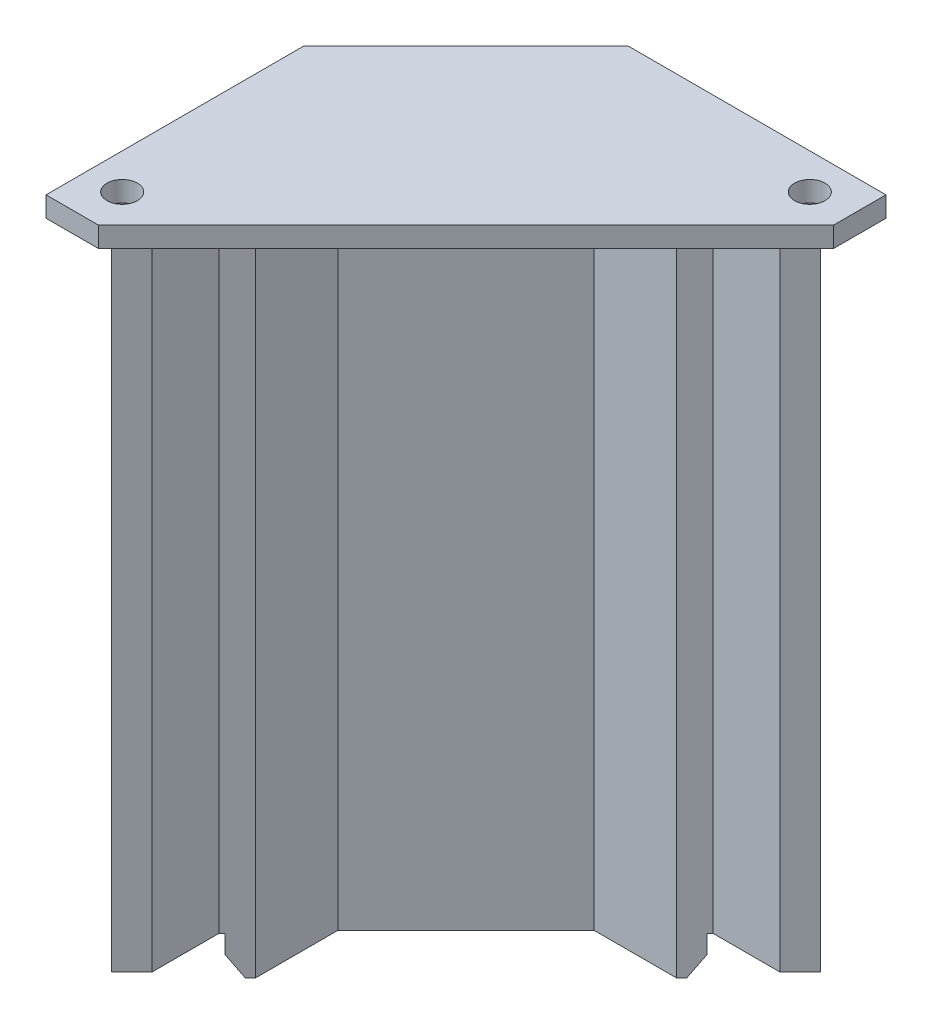
ISO-10303-21;
HEADER;
FILE_DESCRIPTION(('STEP AP214'),'2;1');
FILE_NAME('part.step','',(''),(''),'','','');
FILE_SCHEMA(('AUTOMOTIVE_DESIGN { 1 0 10303 214 1 1 1 1 }'));
ENDSEC;
DATA;
#1=APPLICATION_CONTEXT('core data for automotive mechanical design processes');
#2=APPLICATION_PROTOCOL_DEFINITION('international standard','automotive_design',2000,#1);
#3=PRODUCT_CONTEXT('',#1,'mechanical');
#4=PRODUCT('Part','Part','',(#3));
#5=PRODUCT_RELATED_PRODUCT_CATEGORY('part','',(#4));
#6=PRODUCT_DEFINITION_FORMATION('','',#4);
#7=PRODUCT_DEFINITION_CONTEXT('part definition',#1,'design');
#8=PRODUCT_DEFINITION('design','',#6,#7);
#9=PRODUCT_DEFINITION_SHAPE('','',#8);
#10=(LENGTH_UNIT() NAMED_UNIT(*) SI_UNIT(.MILLI.,.METRE.));
#11=(NAMED_UNIT(*) PLANE_ANGLE_UNIT() SI_UNIT($,.RADIAN.));
#12=(NAMED_UNIT(*) SI_UNIT($,.STERADIAN.) SOLID_ANGLE_UNIT());
#13=UNCERTAINTY_MEASURE_WITH_UNIT(LENGTH_MEASURE(1.E-05),#10,'distance_accuracy_value','');
#14=(GEOMETRIC_REPRESENTATION_CONTEXT(3) GLOBAL_UNCERTAINTY_ASSIGNED_CONTEXT((#13)) GLOBAL_UNIT_ASSIGNED_CONTEXT((#10,
#11,#12)) REPRESENTATION_CONTEXT('',''));
#15=CARTESIAN_POINT('',(0.,0.,0.));
#16=DIRECTION('',(0.,0.,1.));
#17=DIRECTION('',(1.,0.,0.));
#18=AXIS2_PLACEMENT_3D('',#15,#16,#17);
#19=CARTESIAN_POINT('',(182.9,1.6,34.0421356237306));
#20=DIRECTION('',(-1.,0.,0.));
#21=DIRECTION('',(0.,0.,1.));
#22=AXIS2_PLACEMENT_3D('',#19,#20,#21);
#23=PLANE('',#22);
#24=DIRECTION('',(0.,0.577350269189591,0.816496580927751));
#25=VECTOR('',#24,1.);
#26=CARTESIAN_POINT('',(182.9,1.1113737822094,33.3511137995986));
#27=LINE('',#26,#25);
#28=CARTESIAN_POINT('',(182.9,1.6,34.0421356237306));
#29=VERTEX_POINT('',#28);
#30=CARTESIAN_POINT('',(182.9,3.6,36.8705627484756));
#31=VERTEX_POINT('',#30);
#32=EDGE_CURVE('E302',#29,#31,#27,.T.);
#33=ORIENTED_EDGE('',*,*,#32,.F.);
#34=DIRECTION('',(0.,0.,1.));
#35=VECTOR('',#34,1.);
#36=CARTESIAN_POINT('',(182.9,1.6,55.2553390593275));
#37=LINE('',#36,#35);
#38=CARTESIAN_POINT('',(182.9,1.6,54.8310749906156));
#39=VERTEX_POINT('',#38);
#40=EDGE_CURVE('E11',#29,#39,#37,.T.);
#41=ORIENTED_EDGE('',*,*,#40,.T.);
#42=DIRECTION('',(0.,0.,1.));
#43=VECTOR('',#42,1.);
#44=CARTESIAN_POINT('',(182.9,1.6,55.2553390593275));
#45=LINE('',#44,#43);
#46=CARTESIAN_POINT('',(182.9,1.6,62.2553390593273));
#47=VERTEX_POINT('',#46);
#48=EDGE_CURVE('E321',#39,#47,#45,.T.);
#49=ORIENTED_EDGE('',*,*,#48,.T.);
#50=DIRECTION('',(0.,1.,0.));
#51=VECTOR('',#50,1.);
#52=CARTESIAN_POINT('',(182.9,1.6,62.2553390593273));
#53=LINE('',#52,#51);
#54=CARTESIAN_POINT('',(182.9,3.6,62.2553390593273));
#55=VERTEX_POINT('',#54);
#56=EDGE_CURVE('E295',#47,#55,#53,.T.);
#57=ORIENTED_EDGE('',*,*,#56,.T.);
#58=DIRECTION('',(0.,0.,1.));
#59=VECTOR('',#58,1.);
#60=CARTESIAN_POINT('',(182.9,3.6,55.2553390593275));
#61=LINE('',#60,#59);
#62=EDGE_CURVE('E385',#31,#55,#61,.T.);
#63=ORIENTED_EDGE('',*,*,#62,.F.);
#64=EDGE_LOOP('',(#33,#41,#49,#57,#63));
#65=FACE_BOUND('',#64,.T.);
#66=ADVANCED_FACE('F17',(#65),#23,.T.);
#67=CARTESIAN_POINT('',(182.65,1.35,38.0776695296636));
#68=DIRECTION('',(-0.707106781186541,0.707106781186554,0.));
#69=DIRECTION('',(0.,0.,1.));
#70=AXIS2_PLACEMENT_3D('',#67,#68,#69);
#71=PLANE('',#70);
#72=DIRECTION('',(0.577350269189631,0.577350269189619,-0.577350269189628));
#73=VECTOR('',#72,1.);
#74=CARTESIAN_POINT('',(174.004856898707,-7.2951431012931,63.7262180919086));
#75=LINE('',#74,#73);
#76=CARTESIAN_POINT('',(182.4,1.1,55.3310749906154));
#77=VERTEX_POINT('',#76);
#78=EDGE_CURVE('E283',#77,#39,#75,.T.);
#79=ORIENTED_EDGE('',*,*,#78,.T.);
#80=ORIENTED_EDGE('',*,*,#40,.F.);
#81=DIRECTION('',(-0.577350269189631,-0.577350269189619,0.577350269189628));
#82=VECTOR('',#81,1.);
#83=CARTESIAN_POINT('',(184.334433619633,3.03443361963305,32.6077020040979));
#84=LINE('',#83,#82);
#85=CARTESIAN_POINT('',(182.4,1.1,34.5421356237309));
#86=VERTEX_POINT('',#85);
#87=EDGE_CURVE('E274',#29,#86,#84,.T.);
#88=ORIENTED_EDGE('',*,*,#87,.T.);
#89=DIRECTION('',(0.,0.,1.));
#90=VECTOR('',#89,1.);
#91=CARTESIAN_POINT('',(182.4,1.1,38.0776695296636));
#92=LINE('',#91,#90);
#93=EDGE_CURVE('E28',#86,#77,#92,.T.);
#94=ORIENTED_EDGE('',*,*,#93,.T.);
#95=EDGE_LOOP('',(#79,#80,#88,#94));
#96=FACE_BOUND('',#95,.T.);
#97=ADVANCED_FACE('F612',(#96),#71,.T.);
#98=CARTESIAN_POINT('',(182.4,-66.6,34.5421356237309));
#99=DIRECTION('',(-1.,0.,0.));
#100=DIRECTION('',(0.,0.,1.));
#101=AXIS2_PLACEMENT_3D('',#98,#99,#100);
#102=PLANE('',#101);
#103=ORIENTED_EDGE('',*,*,#93,.F.);
#104=DIRECTION('',(0.,1.,0.));
#105=VECTOR('',#104,1.);
#106=CARTESIAN_POINT('',(182.4,-66.6,34.5421356237309));
#107=LINE('',#106,#105);
#108=CARTESIAN_POINT('',(182.4,-66.4,34.5421356237309));
#109=VERTEX_POINT('',#108);
#110=EDGE_CURVE('E278',#109,#86,#107,.T.);
#111=ORIENTED_EDGE('',*,*,#110,.F.);
#112=DIRECTION('',(0.,0.,1.));
#113=VECTOR('',#112,1.);
#114=CARTESIAN_POINT('',(182.4,-66.4,38.0776695296636));
#115=LINE('',#114,#113);
#116=CARTESIAN_POINT('',(182.4,-66.4,55.3310749906154));
#117=VERTEX_POINT('',#116);
#118=EDGE_CURVE('E343',#109,#117,#115,.T.);
#119=ORIENTED_EDGE('',*,*,#118,.T.);
#120=DIRECTION('',(0.,1.,0.));
#121=VECTOR('',#120,1.);
#122=CARTESIAN_POINT('',(182.4,-66.6,55.3310749906154));
#123=LINE('',#122,#121);
#124=EDGE_CURVE('E279',#117,#77,#123,.T.);
#125=ORIENTED_EDGE('',*,*,#124,.T.);
#126=EDGE_LOOP('',(#103,#111,#119,#125));
#127=FACE_BOUND('',#126,.T.);
#128=ADVANCED_FACE('F617',(#127),#102,.T.);
#129=CARTESIAN_POINT('',(185.2,-69.2,36.6307025382526));
#130=DIRECTION('',(-0.894427190999906,-0.447213595499977,0.));
#131=DIRECTION('',(-0.447213595499977,0.894427190999906,0.));
#132=AXIS2_PLACEMENT_3D('',#129,#130,#131);
#133=PLANE('',#132);
#134=DIRECTION('',(0.,0.,1.));
#135=VECTOR('',#134,1.);
#136=CARTESIAN_POINT('',(185.7,-70.2,36.6307025382526));
#137=LINE('',#136,#135);
#138=CARTESIAN_POINT('',(185.7,-70.2,35.9090403795621));
#139=VERTEX_POINT('',#138);
#140=CARTESIAN_POINT('',(185.7,-70.2,45.4357431100375));
#141=VERTEX_POINT('',#140);
#142=EDGE_CURVE('E389',#139,#141,#137,.T.);
#143=ORIENTED_EDGE('',*,*,#142,.T.);
#144=DIRECTION('',(-0.408248290463854,0.816496580927663,0.408248290463998));
#145=VECTOR('',#144,1.);
#146=CARTESIAN_POINT('',(185.408753380982,-69.6175067619646,45.7269897290554));
#147=LINE('',#146,#145);
#148=CARTESIAN_POINT('',(184.7,-68.2,46.435743110038));
#149=VERTEX_POINT('',#148);
#150=EDGE_CURVE('E348',#141,#149,#147,.T.);
#151=ORIENTED_EDGE('',*,*,#150,.T.);
#152=DIRECTION('',(0.,0.,-1.));
#153=VECTOR('',#152,1.);
#154=CARTESIAN_POINT('',(184.7,-68.2,36.6307025382526));
#155=LINE('',#154,#153);
#156=CARTESIAN_POINT('',(184.7,-68.2,35.494826817189));
#157=VERTEX_POINT('',#156);
#158=EDGE_CURVE('E42',#149,#157,#155,.T.);
#159=ORIENTED_EDGE('',*,*,#158,.T.);
#160=DIRECTION('',(-0.439732612032324,0.879465224064601,-0.18214321172152));
#161=VECTOR('',#160,1.);
#162=CARTESIAN_POINT('',(185.7,-70.2,35.9090403795621));
#163=LINE('',#162,#161);
#164=EDGE_CURVE('E328',#139,#157,#163,.T.);
#165=ORIENTED_EDGE('',*,*,#164,.F.);
#166=EDGE_LOOP('',(#143,#151,#159,#165));
#167=FACE_BOUND('',#166,.T.);
#168=ADVANCED_FACE('F19',(#167),#133,.T.);
#169=CARTESIAN_POINT('',(184.7,-70.6,35.494826817189));
#170=DIRECTION('',(-1.,0.,0.));
#171=DIRECTION('',(0.,0.,1.));
#172=AXIS2_PLACEMENT_3D('',#169,#170,#171);
#173=PLANE('',#172);
#174=ORIENTED_EDGE('',*,*,#158,.F.);
#175=DIRECTION('',(0.,-1.,0.));
#176=VECTOR('',#175,1.);
#177=CARTESIAN_POINT('',(184.7,-66.6,46.435743110038));
#178=LINE('',#177,#176);
#179=CARTESIAN_POINT('',(184.7,-66.4,46.435743110038));
#180=VERTEX_POINT('',#179);
#181=EDGE_CURVE('E345',#180,#149,#178,.T.);
#182=ORIENTED_EDGE('',*,*,#181,.F.);
#183=DIRECTION('',(0.,0.,-1.));
#184=VECTOR('',#183,1.);
#185=CARTESIAN_POINT('',(184.7,-66.4,38.5540151263927));
#186=LINE('',#185,#184);
#187=CARTESIAN_POINT('',(184.7,-66.4,35.494826817189));
#188=VERTEX_POINT('',#187);
#189=EDGE_CURVE('E363',#180,#188,#186,.T.);
#190=ORIENTED_EDGE('',*,*,#189,.T.);
#191=DIRECTION('',(0.,1.,0.));
#192=VECTOR('',#191,1.);
#193=CARTESIAN_POINT('',(184.7,-70.6,35.494826817189));
#194=LINE('',#193,#192);
#195=EDGE_CURVE('E369',#157,#188,#194,.T.);
#196=ORIENTED_EDGE('',*,*,#195,.F.);
#197=EDGE_LOOP('',(#174,#182,#190,#196));
#198=FACE_BOUND('',#197,.T.);
#199=ADVANCED_FACE('F1158',(#198),#173,.T.);
#200=CARTESIAN_POINT('',(184.4,-66.6,46.7357431100381));
#201=DIRECTION('',(0.707106781186671,0.,0.707106781186424));
#202=DIRECTION('',(0.,-1.,0.));
#203=AXIS2_PLACEMENT_3D('',#200,#201,#202);
#204=PLANE('',#203);
#205=ORIENTED_EDGE('',*,*,#150,.F.);
#206=DIRECTION('',(0.707106781186424,0.,-0.707106781186671));
#207=VECTOR('',#206,1.);
#208=CARTESIAN_POINT('',(187.649550410227,-70.2,43.48619269981));
#209=LINE('',#208,#207);
#210=CARTESIAN_POINT('',(186.2,-70.2,44.935743110038));
#211=VERTEX_POINT('',#210);
#212=EDGE_CURVE('E397',#141,#211,#209,.T.);
#213=ORIENTED_EDGE('',*,*,#212,.T.);
#214=DIRECTION('',(0.,1.,0.));
#215=VECTOR('',#214,1.);
#216=CARTESIAN_POINT('',(186.2,-66.6,44.935743110038));
#217=LINE('',#216,#215);
#218=CARTESIAN_POINT('',(186.2,1.6,44.935743110038));
#219=VERTEX_POINT('',#218);
#220=EDGE_CURVE('E402',#211,#219,#217,.T.);
#221=ORIENTED_EDGE('',*,*,#220,.T.);
#222=DIRECTION('',(0.707106781186424,0.,-0.707106781186671));
#223=VECTOR('',#222,1.);
#224=CARTESIAN_POINT('',(187.400147000411,1.6,43.7355961096264));
#225=LINE('',#224,#223);
#226=CARTESIAN_POINT('',(184.4,1.6,46.7357431100381));
#227=VERTEX_POINT('',#226);
#228=EDGE_CURVE('E430',#227,#219,#225,.T.);
#229=ORIENTED_EDGE('',*,*,#228,.F.);
#230=DIRECTION('',(0.,1.,0.));
#231=VECTOR('',#230,1.);
#232=CARTESIAN_POINT('',(184.4,-66.6,46.7357431100381));
#233=LINE('',#232,#231);
#234=CARTESIAN_POINT('',(184.4,-66.4,46.7357431100381));
#235=VERTEX_POINT('',#234);
#236=EDGE_CURVE('E292',#235,#227,#233,.T.);
#237=ORIENTED_EDGE('',*,*,#236,.F.);
#238=DIRECTION('',(0.707106781186424,0.,-0.707106781186671));
#239=VECTOR('',#238,1.);
#240=CARTESIAN_POINT('',(186.400394116157,-66.4,44.7353489938804));
#241=LINE('',#240,#239);
#242=EDGE_CURVE('E367',#235,#180,#241,.T.);
#243=ORIENTED_EDGE('',*,*,#242,.T.);
#244=ORIENTED_EDGE('',*,*,#181,.T.);
#245=EDGE_LOOP('',(#205,#213,#221,#229,#237,#243,#244));
#246=FACE_BOUND('',#245,.T.);
#247=ADVANCED_FACE('F602',(#246),#204,.T.);
#248=CARTESIAN_POINT('',(186.2,-66.6,44.935743110038));
#249=DIRECTION('',(1.,0.,0.));
#250=DIRECTION('',(0.,0.,1.));
#251=AXIS2_PLACEMENT_3D('',#248,#249,#250);
#252=PLANE('',#251);
#253=DIRECTION('',(0.,0.,-1.));
#254=VECTOR('',#253,1.);
#255=CARTESIAN_POINT('',(186.2,-70.2,41.3511606846771));
#256=LINE('',#255,#254);
#257=CARTESIAN_POINT('',(186.2,-70.2,36.8232539419352));
#258=VERTEX_POINT('',#257);
#259=EDGE_CURVE('E401',#211,#258,#256,.T.);
#260=ORIENTED_EDGE('',*,*,#259,.T.);
#261=DIRECTION('',(0.,1.,0.));
#262=VECTOR('',#261,1.);
#263=CARTESIAN_POINT('',(186.2,-66.6,36.8232539419353));
#264=LINE('',#263,#262);
#265=CARTESIAN_POINT('',(186.2,1.6,36.8232539419352));
#266=VERTEX_POINT('',#265);
#267=EDGE_CURVE('E469',#258,#266,#264,.T.);
#268=ORIENTED_EDGE('',*,*,#267,.T.);
#269=DIRECTION('',(0.,0.,-1.));
#270=VECTOR('',#269,1.);
#271=CARTESIAN_POINT('',(186.2,1.6,44.8994732728172));
#272=LINE('',#271,#270);
#273=EDGE_CURVE('E315',#219,#266,#272,.T.);
#274=ORIENTED_EDGE('',*,*,#273,.F.);
#275=ORIENTED_EDGE('',*,*,#220,.F.);
#276=EDGE_LOOP('',(#260,#268,#274,#275));
#277=FACE_BOUND('',#276,.T.);
#278=ADVANCED_FACE('F1139',(#277),#252,.T.);
#279=CARTESIAN_POINT('',(184.4,-66.6,53.7553390593273));
#280=DIRECTION('',(1.,0.,0.));
#281=DIRECTION('',(0.,0.,1.));
#282=AXIS2_PLACEMENT_3D('',#279,#280,#281);
#283=PLANE('',#282);
#284=DIRECTION('',(0.,0.,-1.));
#285=VECTOR('',#284,1.);
#286=CARTESIAN_POINT('',(184.4,-66.4,47.6842712474618));
#287=LINE('',#286,#285);
#288=CARTESIAN_POINT('',(184.4,-66.4,53.3310749906154));
#289=VERTEX_POINT('',#288);
#290=EDGE_CURVE('E344',#289,#235,#287,.T.);
#291=ORIENTED_EDGE('',*,*,#290,.T.);
#292=ORIENTED_EDGE('',*,*,#236,.T.);
#293=DIRECTION('',(0.,0.,-1.));
#294=VECTOR('',#293,1.);
#295=CARTESIAN_POINT('',(184.4,1.6,49.3092712474618));
#296=LINE('',#295,#294);
#297=CARTESIAN_POINT('',(184.4,1.6,53.3310749906153));
#298=VERTEX_POINT('',#297);
#299=EDGE_CURVE('E320',#298,#227,#296,.T.);
#300=ORIENTED_EDGE('',*,*,#299,.F.);
#301=DIRECTION('',(0.,1.,0.));
#302=VECTOR('',#301,1.);
#303=CARTESIAN_POINT('',(184.4,-66.6,53.3310749906153));
#304=LINE('',#303,#302);
#305=EDGE_CURVE('E282',#289,#298,#304,.T.);
#306=ORIENTED_EDGE('',*,*,#305,.F.);
#307=EDGE_LOOP('',(#291,#292,#300,#306));
#308=FACE_BOUND('',#307,.T.);
#309=ADVANCED_FACE('F590',(#308),#283,.T.);
#310=CARTESIAN_POINT('',(182.187867965644,-66.6,55.5432070249713));
#311=DIRECTION('',(0.707106781186546,0.,0.707106781186549));
#312=DIRECTION('',(0.,-1.,0.));
#313=AXIS2_PLACEMENT_3D('',#310,#311,#312);
#314=PLANE('',#313);
#315=ORIENTED_EDGE('',*,*,#78,.F.);
#316=ORIENTED_EDGE('',*,*,#124,.F.);
#317=DIRECTION('',(0.707106781186549,0.,-0.707106781186546));
#318=VECTOR('',#317,1.);
#319=CARTESIAN_POINT('',(186.943161069124,-66.4,50.7879139214918));
#320=LINE('',#319,#318);
#321=EDGE_CURVE('E339',#117,#289,#320,.T.);
#322=ORIENTED_EDGE('',*,*,#321,.T.);
#323=ORIENTED_EDGE('',*,*,#305,.T.);
#324=DIRECTION('',(0.707106781186549,0.,-0.707106781186546));
#325=VECTOR('',#324,1.);
#326=CARTESIAN_POINT('',(187.942913953378,1.6,49.7881610372375));
#327=LINE('',#326,#325);
#328=EDGE_CURVE('E316',#39,#298,#327,.T.);
#329=ORIENTED_EDGE('',*,*,#328,.F.);
#330=EDGE_LOOP('',(#315,#316,#322,#323,#329));
#331=FACE_BOUND('',#330,.T.);
#332=ADVANCED_FACE('F595',(#331),#314,.T.);
#333=CARTESIAN_POINT('',(182.9,1.6,62.2553390593273));
#334=DIRECTION('',(0.,0.,1.));
#335=DIRECTION('',(1.,0.,0.));
#336=AXIS2_PLACEMENT_3D('',#333,#334,#335);
#337=PLANE('',#336);
#338=DIRECTION('',(1.,0.,0.));
#339=VECTOR('',#338,1.);
#340=CARTESIAN_POINT('',(182.9,1.6,62.2553390593273));
#341=LINE('',#340,#339);
#342=CARTESIAN_POINT('',(188.056854249492,1.6,62.2553390593273));
#343=VERTEX_POINT('',#342);
#344=EDGE_CURVE('E246',#47,#343,#341,.T.);
#345=ORIENTED_EDGE('',*,*,#344,.T.);
#346=DIRECTION('',(0.,1.,0.));
#347=VECTOR('',#346,1.);
#348=CARTESIAN_POINT('',(188.056854249492,1.6,62.2553390593273));
#349=LINE('',#348,#347);
#350=CARTESIAN_POINT('',(188.056854249492,3.6,62.2553390593273));
#351=VERTEX_POINT('',#350);
#352=EDGE_CURVE('E354',#343,#351,#349,.T.);
#353=ORIENTED_EDGE('',*,*,#352,.T.);
#354=DIRECTION('',(1.,0.,0.));
#355=VECTOR('',#354,1.);
#356=CARTESIAN_POINT('',(182.9,3.6,62.2553390593273));
#357=LINE('',#356,#355);
#358=EDGE_CURVE('E380',#55,#351,#357,.T.);
#359=ORIENTED_EDGE('',*,*,#358,.F.);
#360=ORIENTED_EDGE('',*,*,#56,.F.);
#361=EDGE_LOOP('',(#345,#353,#359,#360));
#362=FACE_BOUND('',#361,.T.);
#363=ADVANCED_FACE('F1111',(#362),#337,.T.);
#364=CARTESIAN_POINT('',(193.26196337015,2.6,25.094385815954));
#365=DIRECTION('',(0.5,-0.707106781186547,0.5));
#366=DIRECTION('',(-0.816496580927726,-0.577350269189626,0.));
#367=AXIS2_PLACEMENT_3D('',#364,#365,#366);
#368=PLANE('',#367);
#369=DIRECTION('',(0.816496580927751,0.577350269189591,0.));
#370=VECTOR('',#369,1.);
#371=CARTESIAN_POINT('',(195.351113799599,1.1113737822094,20.9000000000017));
#372=LINE('',#371,#370);
#373=CARTESIAN_POINT('',(196.042135623731,1.6,20.9));
#374=VERTEX_POINT('',#373);
#375=CARTESIAN_POINT('',(198.870562748476,3.6,20.9000000000014));
#376=VERTEX_POINT('',#375);
#377=EDGE_CURVE('E277',#374,#376,#372,.T.);
#378=ORIENTED_EDGE('',*,*,#377,.F.);
#379=DIRECTION('',(0.707106781186548,0.,-0.707106781186548));
#380=VECTOR('',#379,1.);
#381=CARTESIAN_POINT('',(192.554856588963,1.6,24.3872790347674));
#382=LINE('',#381,#380);
#383=EDGE_CURVE('E336',#29,#374,#382,.T.);
#384=ORIENTED_EDGE('',*,*,#383,.F.);
#385=ORIENTED_EDGE('',*,*,#32,.T.);
#386=DIRECTION('',(0.707106781186549,0.,-0.707106781186546));
#387=VECTOR('',#386,1.);
#388=CARTESIAN_POINT('',(187.801492597141,3.6,31.9690701513365));
#389=LINE('',#388,#387);
#390=EDGE_CURVE('E308',#31,#376,#389,.T.);
#391=ORIENTED_EDGE('',*,*,#390,.T.);
#392=EDGE_LOOP('',(#378,#384,#385,#391));
#393=FACE_BOUND('',#392,.T.);
#394=ADVANCED_FACE('F1103',(#393),#368,.F.);
#395=CARTESIAN_POINT('',(196.042135623731,1.6,20.9000000000017));
#396=DIRECTION('',(0.,0.,1.));
#397=DIRECTION('',(1.,0.,0.));
#398=AXIS2_PLACEMENT_3D('',#395,#396,#397);
#399=PLANE('',#398);
#400=ORIENTED_EDGE('',*,*,#377,.T.);
#401=DIRECTION('',(1.,0.,0.));
#402=VECTOR('',#401,1.);
#403=CARTESIAN_POINT('',(217.255339059328,3.6,20.8999999999997));
#404=LINE('',#403,#402);
#405=CARTESIAN_POINT('',(224.255339059327,3.6,20.8999999999991));
#406=VERTEX_POINT('',#405);
#407=EDGE_CURVE('E252',#376,#406,#404,.T.);
#408=ORIENTED_EDGE('',*,*,#407,.T.);
#409=DIRECTION('',(0.,1.,0.));
#410=VECTOR('',#409,1.);
#411=CARTESIAN_POINT('',(224.255339059327,1.6,20.8999999999991));
#412=LINE('',#411,#410);
#413=CARTESIAN_POINT('',(224.255339059327,1.6,20.8999999999991));
#414=VERTEX_POINT('',#413);
#415=EDGE_CURVE('E249',#414,#406,#412,.T.);
#416=ORIENTED_EDGE('',*,*,#415,.F.);
#417=DIRECTION('',(1.,0.,0.));
#418=VECTOR('',#417,1.);
#419=CARTESIAN_POINT('',(217.255339059328,1.6,20.8999999999997));
#420=LINE('',#419,#418);
#421=CARTESIAN_POINT('',(216.831074990616,1.6,20.8999999999997));
#422=VERTEX_POINT('',#421);
#423=EDGE_CURVE('E234',#422,#414,#420,.T.);
#424=ORIENTED_EDGE('',*,*,#423,.F.);
#425=DIRECTION('',(1.,0.,0.));
#426=VECTOR('',#425,1.);
#427=CARTESIAN_POINT('',(217.255339059328,1.6,20.8999999999997));
#428=LINE('',#427,#426);
#429=EDGE_CURVE('E393',#374,#422,#428,.T.);
#430=ORIENTED_EDGE('',*,*,#429,.F.);
#431=EDGE_LOOP('',(#400,#408,#416,#424,#430));
#432=FACE_BOUND('',#431,.T.);
#433=ADVANCED_FACE('F250',(#432),#399,.F.);
#434=CARTESIAN_POINT('',(189.471067811865,1.6,27.4710678118654));
#435=DIRECTION('',(0.707106781186548,0.,0.707106781186548));
#436=DIRECTION('',(0.,-1.,0.));
#437=AXIS2_PLACEMENT_3D('',#434,#435,#436);
#438=PLANE('',#437);
#439=ORIENTED_EDGE('',*,*,#383,.T.);
#440=DIRECTION('',(0.577350269189629,-0.577350269189619,-0.577350269189629));
#441=VECTOR('',#440,1.);
#442=CARTESIAN_POINT('',(194.607702004098,3.03443361963305,22.334433619633));
#443=LINE('',#442,#441);
#444=CARTESIAN_POINT('',(196.542135623731,1.1,20.4));
#445=VERTEX_POINT('',#444);
#446=EDGE_CURVE('E440',#374,#445,#443,.T.);
#447=ORIENTED_EDGE('',*,*,#446,.T.);
#448=DIRECTION('',(0.,1.,0.));
#449=VECTOR('',#448,1.);
#450=CARTESIAN_POINT('',(196.542135623731,-66.6,20.4));
#451=LINE('',#450,#449);
#452=CARTESIAN_POINT('',(196.542135623731,-66.4,20.4));
#453=VERTEX_POINT('',#452);
#454=EDGE_CURVE('E437',#453,#445,#451,.T.);
#455=ORIENTED_EDGE('',*,*,#454,.F.);
#456=DIRECTION('',(0.707106781186548,0.,-0.707106781186548));
#457=VECTOR('',#456,1.);
#458=CARTESIAN_POINT('',(193.554609473218,-66.4,23.3875261505131));
#459=LINE('',#458,#457);
#460=EDGE_CURVE('E413',#109,#453,#459,.T.);
#461=ORIENTED_EDGE('',*,*,#460,.F.);
#462=ORIENTED_EDGE('',*,*,#110,.T.);
#463=ORIENTED_EDGE('',*,*,#87,.F.);
#464=EDGE_LOOP('',(#439,#447,#455,#461,#462,#463));
#465=FACE_BOUND('',#464,.T.);
#466=ADVANCED_FACE('F616',(#465),#438,.F.);
#467=CARTESIAN_POINT('',(200.077669529664,1.35,20.65));
#468=DIRECTION('',(0.,-0.707106781186554,0.707106781186541));
#469=DIRECTION('',(-1.,0.,0.));
#470=AXIS2_PLACEMENT_3D('',#467,#468,#469);
#471=PLANE('',#470);
#472=DIRECTION('',(-0.577350269189629,0.577350269189619,0.577350269189629));
#473=VECTOR('',#472,1.);
#474=CARTESIAN_POINT('',(225.726218091909,-7.2951431012931,12.0048568987066));
#475=LINE('',#474,#473);
#476=CARTESIAN_POINT('',(217.331074990615,1.1,20.4));
#477=VERTEX_POINT('',#476);
#478=EDGE_CURVE('E423',#477,#422,#475,.T.);
#479=ORIENTED_EDGE('',*,*,#478,.F.);
#480=DIRECTION('',(1.,0.,0.));
#481=VECTOR('',#480,1.);
#482=CARTESIAN_POINT('',(200.077669529664,1.1,20.4));
#483=LINE('',#482,#481);
#484=EDGE_CURVE('E123',#445,#477,#483,.T.);
#485=ORIENTED_EDGE('',*,*,#484,.F.);
#486=ORIENTED_EDGE('',*,*,#446,.F.);
#487=ORIENTED_EDGE('',*,*,#429,.T.);
#488=EDGE_LOOP('',(#479,#485,#486,#487));
#489=FACE_BOUND('',#488,.T.);
#490=ADVANCED_FACE('F1076',(#489),#471,.F.);
#491=CARTESIAN_POINT('',(196.542135623731,-66.6,20.4));
#492=DIRECTION('',(0.,0.,1.));
#493=DIRECTION('',(1.,0.,0.));
#494=AXIS2_PLACEMENT_3D('',#491,#492,#493);
#495=PLANE('',#494);
#496=ORIENTED_EDGE('',*,*,#484,.T.);
#497=DIRECTION('',(0.,1.,0.));
#498=VECTOR('',#497,1.);
#499=CARTESIAN_POINT('',(217.331074990615,-66.6,20.4));
#500=LINE('',#499,#498);
#501=CARTESIAN_POINT('',(217.331074990615,-66.4,20.4));
#502=VERTEX_POINT('',#501);
#503=EDGE_CURVE('E358',#502,#477,#500,.T.);
#504=ORIENTED_EDGE('',*,*,#503,.F.);
#505=DIRECTION('',(1.,0.,0.));
#506=VECTOR('',#505,1.);
#507=CARTESIAN_POINT('',(200.077669529664,-66.4,20.4));
#508=LINE('',#507,#506);
#509=EDGE_CURVE('E434',#453,#502,#508,.T.);
#510=ORIENTED_EDGE('',*,*,#509,.F.);
#511=ORIENTED_EDGE('',*,*,#454,.T.);
#512=EDGE_LOOP('',(#496,#504,#510,#511));
#513=FACE_BOUND('',#512,.T.);
#514=ADVANCED_FACE('F621',(#513),#495,.F.);
#515=CARTESIAN_POINT('',(194.28535216647,-69.2,26.6165814319055));
#516=DIRECTION('',(0.632455532033669,0.447213595499977,0.632455532033669));
#517=DIRECTION('',(0.,-0.816496580927712,0.577350269189646));
#518=AXIS2_PLACEMENT_3D('',#515,#516,#517);
#519=PLANE('',#518);
#520=DIRECTION('',(-0.707106781186548,0.,0.707106781186548));
#521=VECTOR('',#520,1.);
#522=CARTESIAN_POINT('',(193.931798775877,-68.2,26.2630280413122));
#523=LINE('',#522,#521);
#524=CARTESIAN_POINT('',(197.494826817189,-68.2,22.7));
#525=VERTEX_POINT('',#524);
#526=EDGE_CURVE('E373',#525,#157,#523,.T.);
#527=ORIENTED_EDGE('',*,*,#526,.F.);
#528=DIRECTION('',(-0.182143211721519,0.879465224064601,-0.439732612032324));
#529=VECTOR('',#528,1.);
#530=CARTESIAN_POINT('',(197.909040379562,-70.2,23.7));
#531=LINE('',#530,#529);
#532=CARTESIAN_POINT('',(197.909040379562,-70.2,23.7));
#533=VERTEX_POINT('',#532);
#534=EDGE_CURVE('E332',#533,#525,#531,.T.);
#535=ORIENTED_EDGE('',*,*,#534,.F.);
#536=DIRECTION('',(0.707106781186548,0.,-0.707106781186548));
#537=VECTOR('',#536,1.);
#538=CARTESIAN_POINT('',(194.638905557063,-70.2,26.9701348224988));
#539=LINE('',#538,#537);
#540=EDGE_CURVE('E448',#139,#533,#539,.T.);
#541=ORIENTED_EDGE('',*,*,#540,.F.);
#542=ORIENTED_EDGE('',*,*,#164,.T.);
#543=EDGE_LOOP('',(#527,#535,#541,#542));
#544=FACE_BOUND('',#543,.T.);
#545=ADVANCED_FACE('F642',(#544),#519,.F.);
#546=CARTESIAN_POINT('',(198.630702538253,-69.2,23.2));
#547=DIRECTION('',(0.,0.447213595499977,0.894427190999906));
#548=DIRECTION('',(1.,0.,0.));
#549=AXIS2_PLACEMENT_3D('',#546,#547,#548);
#550=PLANE('',#549);
#551=DIRECTION('',(1.,0.,0.));
#552=VECTOR('',#551,1.);
#553=CARTESIAN_POINT('',(198.630702538253,-70.2,23.7));
#554=LINE('',#553,#552);
#555=CARTESIAN_POINT('',(207.435743110038,-70.2,23.7));
#556=VERTEX_POINT('',#555);
#557=EDGE_CURVE('E443',#533,#556,#554,.T.);
#558=ORIENTED_EDGE('',*,*,#557,.F.);
#559=ORIENTED_EDGE('',*,*,#534,.T.);
#560=DIRECTION('',(-1.,0.,0.));
#561=VECTOR('',#560,1.);
#562=CARTESIAN_POINT('',(198.630702538253,-68.2,22.7));
#563=LINE('',#562,#561);
#564=CARTESIAN_POINT('',(208.435743110038,-68.2,22.7));
#565=VERTEX_POINT('',#564);
#566=EDGE_CURVE('E518',#565,#525,#563,.T.);
#567=ORIENTED_EDGE('',*,*,#566,.F.);
#568=DIRECTION('',(0.408248290463998,0.816496580927663,-0.408248290463854));
#569=VECTOR('',#568,1.);
#570=CARTESIAN_POINT('',(207.726989729055,-69.6175067619646,23.4087533809823));
#571=LINE('',#570,#569);
#572=EDGE_CURVE('E322',#556,#565,#571,.T.);
#573=ORIENTED_EDGE('',*,*,#572,.F.);
#574=EDGE_LOOP('',(#558,#559,#567,#573));
#575=FACE_BOUND('',#574,.T.);
#576=ADVANCED_FACE('F561',(#575),#550,.F.);
#577=CARTESIAN_POINT('',(191.097413408595,-70.6,29.0974134085945));
#578=DIRECTION('',(0.707106781186548,0.,0.707106781186548));
#579=DIRECTION('',(0.,-1.,0.));
#580=AXIS2_PLACEMENT_3D('',#577,#578,#579);
#581=PLANE('',#580);
#582=ORIENTED_EDGE('',*,*,#526,.T.);
#583=ORIENTED_EDGE('',*,*,#195,.T.);
#584=DIRECTION('',(0.707106781186549,0.,-0.707106781186546));
#585=VECTOR('',#584,1.);
#586=CARTESIAN_POINT('',(187.013871747242,-66.4,33.1809550699468));
#587=LINE('',#586,#585);
#588=CARTESIAN_POINT('',(197.494826817189,-66.4,22.7));
#589=VERTEX_POINT('',#588);
#590=EDGE_CURVE('E368',#188,#589,#587,.T.);
#591=ORIENTED_EDGE('',*,*,#590,.T.);
#592=DIRECTION('',(0.,1.,0.));
#593=VECTOR('',#592,1.);
#594=CARTESIAN_POINT('',(197.494826817189,-70.6,22.7));
#595=LINE('',#594,#593);
#596=EDGE_CURVE('E21',#525,#589,#595,.T.);
#597=ORIENTED_EDGE('',*,*,#596,.F.);
#598=EDGE_LOOP('',(#582,#583,#591,#597));
#599=FACE_BOUND('',#598,.T.);
#600=ADVANCED_FACE('F645',(#599),#581,.F.);
#601=CARTESIAN_POINT('',(197.494826817189,-70.6,22.7));
#602=DIRECTION('',(0.,0.,1.));
#603=DIRECTION('',(1.,0.,0.));
#604=AXIS2_PLACEMENT_3D('',#601,#602,#603);
#605=PLANE('',#604);
#606=ORIENTED_EDGE('',*,*,#566,.T.);
#607=ORIENTED_EDGE('',*,*,#596,.T.);
#608=DIRECTION('',(-1.,0.,0.));
#609=VECTOR('',#608,1.);
#610=CARTESIAN_POINT('',(200.554015126393,-66.4,22.7));
#611=LINE('',#610,#609);
#612=CARTESIAN_POINT('',(208.435743110038,-66.4,22.7));
#613=VERTEX_POINT('',#612);
#614=EDGE_CURVE('E327',#613,#589,#611,.T.);
#615=ORIENTED_EDGE('',*,*,#614,.F.);
#616=DIRECTION('',(0.,-1.,0.));
#617=VECTOR('',#616,1.);
#618=CARTESIAN_POINT('',(208.435743110038,-66.6,22.7));
#619=LINE('',#618,#617);
#620=EDGE_CURVE('E326',#613,#565,#619,.T.);
#621=ORIENTED_EDGE('',*,*,#620,.T.);
#622=EDGE_LOOP('',(#606,#607,#615,#621));
#623=FACE_BOUND('',#622,.T.);
#624=ADVANCED_FACE('F554',(#623),#605,.F.);
#625=CARTESIAN_POINT('',(208.735743110038,-66.6,22.4));
#626=DIRECTION('',(-0.707106781186422,0.,-0.707106781186673));
#627=DIRECTION('',(-0.707106781186673,0.,0.707106781186422));
#628=AXIS2_PLACEMENT_3D('',#625,#626,#627);
#629=PLANE('',#628);
#630=ORIENTED_EDGE('',*,*,#572,.T.);
#631=ORIENTED_EDGE('',*,*,#620,.F.);
#632=DIRECTION('',(-0.707106781186673,0.,0.707106781186422));
#633=VECTOR('',#632,1.);
#634=CARTESIAN_POINT('',(206.73534899388,-66.4,24.4003941161569));
#635=LINE('',#634,#633);
#636=CARTESIAN_POINT('',(208.735743110038,-66.4,22.4));
#637=VERTEX_POINT('',#636);
#638=EDGE_CURVE('E408',#637,#613,#635,.T.);
#639=ORIENTED_EDGE('',*,*,#638,.F.);
#640=DIRECTION('',(0.,1.,0.));
#641=VECTOR('',#640,1.);
#642=CARTESIAN_POINT('',(208.735743110038,-66.6,22.4));
#643=LINE('',#642,#641);
#644=CARTESIAN_POINT('',(208.735743110038,1.6,22.4));
#645=VERTEX_POINT('',#644);
#646=EDGE_CURVE('E140',#637,#645,#643,.T.);
#647=ORIENTED_EDGE('',*,*,#646,.T.);
#648=DIRECTION('',(-0.707106781186673,0.,0.707106781186422));
#649=VECTOR('',#648,1.);
#650=CARTESIAN_POINT('',(205.735596109626,1.6,25.4001470004106));
#651=LINE('',#650,#649);
#652=CARTESIAN_POINT('',(206.935743110038,1.6,24.2));
#653=VERTEX_POINT('',#652);
#654=EDGE_CURVE('E475',#645,#653,#651,.T.);
#655=ORIENTED_EDGE('',*,*,#654,.T.);
#656=DIRECTION('',(0.,1.,0.));
#657=VECTOR('',#656,1.);
#658=CARTESIAN_POINT('',(206.935743110038,-66.6,24.2));
#659=LINE('',#658,#657);
#660=CARTESIAN_POINT('',(206.935743110038,-70.2,24.2));
#661=VERTEX_POINT('',#660);
#662=EDGE_CURVE('E462',#661,#653,#659,.T.);
#663=ORIENTED_EDGE('',*,*,#662,.F.);
#664=DIRECTION('',(-0.707106781186673,0.,0.707106781186422));
#665=VECTOR('',#664,1.);
#666=CARTESIAN_POINT('',(205.48619269981,-70.2,25.6495504102268));
#667=LINE('',#666,#665);
#668=EDGE_CURVE('E447',#556,#661,#667,.T.);
#669=ORIENTED_EDGE('',*,*,#668,.F.);
#670=EDGE_LOOP('',(#630,#631,#639,#647,#655,#663,#669));
#671=FACE_BOUND('',#670,.T.);
#672=ADVANCED_FACE('F557',(#671),#629,.F.);
#673=CARTESIAN_POINT('',(203.613203435596,-66.4,25.2790367901871));
#674=DIRECTION('',(0.,-1.,0.));
#675=DIRECTION('',(0.,0.,-1.));
#676=AXIS2_PLACEMENT_3D('',#673,#674,#675);
#677=PLANE('',#676);
#678=ORIENTED_EDGE('',*,*,#590,.F.);
#679=ORIENTED_EDGE('',*,*,#189,.F.);
#680=ORIENTED_EDGE('',*,*,#242,.F.);
#681=ORIENTED_EDGE('',*,*,#290,.F.);
#682=ORIENTED_EDGE('',*,*,#321,.F.);
#683=ORIENTED_EDGE('',*,*,#118,.F.);
#684=ORIENTED_EDGE('',*,*,#460,.T.);
#685=ORIENTED_EDGE('',*,*,#509,.T.);
#686=DIRECTION('',(-0.707106781186548,0.,0.707106781186548));
#687=VECTOR('',#686,1.);
#688=CARTESIAN_POINT('',(212.787913921492,-66.4,24.9431610691235));
#689=LINE('',#688,#687);
#690=CARTESIAN_POINT('',(215.331074990615,-66.4,22.4));
#691=VERTEX_POINT('',#690);
#692=EDGE_CURVE('E362',#502,#691,#689,.T.);
#693=ORIENTED_EDGE('',*,*,#692,.T.);
#694=DIRECTION('',(-1.,0.,0.));
#695=VECTOR('',#694,1.);
#696=CARTESIAN_POINT('',(209.684271247462,-66.4,22.4));
#697=LINE('',#696,#695);
#698=EDGE_CURVE('E361',#691,#637,#697,.T.);
#699=ORIENTED_EDGE('',*,*,#698,.T.);
#700=ORIENTED_EDGE('',*,*,#638,.T.);
#701=ORIENTED_EDGE('',*,*,#614,.T.);
#702=EDGE_LOOP('',(#678,#679,#680,#681,#682,#683,#684,#685,#693,#699,#700,#701));
#703=FACE_BOUND('',#702,.T.);
#704=ADVANCED_FACE('F599',(#703),#677,.T.);
#705=CARTESIAN_POINT('',(199.766578259316,-70.2,26.4290367901871));
#706=DIRECTION('',(0.,-1.,0.));
#707=DIRECTION('',(0.,0.,-1.));
#708=AXIS2_PLACEMENT_3D('',#705,#706,#707);
#709=PLANE('',#708);
#710=ORIENTED_EDGE('',*,*,#540,.T.);
#711=ORIENTED_EDGE('',*,*,#557,.T.);
#712=ORIENTED_EDGE('',*,*,#668,.T.);
#713=DIRECTION('',(-1.,0.,0.));
#714=VECTOR('',#713,1.);
#715=CARTESIAN_POINT('',(203.351160684677,-70.2,24.2));
#716=LINE('',#715,#714);
#717=CARTESIAN_POINT('',(198.823253941935,-70.2,24.2));
#718=VERTEX_POINT('',#717);
#719=EDGE_CURVE('E458',#661,#718,#716,.T.);
#720=ORIENTED_EDGE('',*,*,#719,.T.);
#721=DIRECTION('',(0.707106781186549,0.,-0.707106781186546));
#722=VECTOR('',#721,1.);
#723=CARTESIAN_POINT('',(186.698204813498,-70.2,36.3250491284371));
#724=LINE('',#723,#722);
#725=EDGE_CURVE('E272',#258,#718,#724,.T.);
#726=ORIENTED_EDGE('',*,*,#725,.F.);
#727=ORIENTED_EDGE('',*,*,#259,.F.);
#728=ORIENTED_EDGE('',*,*,#212,.F.);
#729=ORIENTED_EDGE('',*,*,#142,.F.);
#730=EDGE_LOOP('',(#710,#711,#712,#720,#726,#727,#728,#729));
#731=FACE_BOUND('',#730,.T.);
#732=ADVANCED_FACE('F635',(#731),#709,.T.);
#733=CARTESIAN_POINT('',(198.469700551342,-66.6,24.5535533905932));
#734=DIRECTION('',(-0.707106781186548,0.,-0.707106781186548));
#735=DIRECTION('',(-0.707106781186548,0.,0.707106781186548));
#736=AXIS2_PLACEMENT_3D('',#733,#734,#735);
#737=PLANE('',#736);
#738=ORIENTED_EDGE('',*,*,#725,.T.);
#739=DIRECTION('',(0.,1.,0.));
#740=VECTOR('',#739,1.);
#741=CARTESIAN_POINT('',(198.823253941935,-66.6,24.2));
#742=LINE('',#741,#740);
#743=CARTESIAN_POINT('',(198.823253941935,1.6,24.2));
#744=VERTEX_POINT('',#743);
#745=EDGE_CURVE('E482',#718,#744,#742,.T.);
#746=ORIENTED_EDGE('',*,*,#745,.T.);
#747=DIRECTION('',(0.707106781186549,0.,-0.707106781186546));
#748=VECTOR('',#747,1.);
#749=CARTESIAN_POINT('',(186.448801403682,1.6,36.5744525382527));
#750=LINE('',#749,#748);
#751=EDGE_CURVE('E310',#266,#744,#750,.T.);
#752=ORIENTED_EDGE('',*,*,#751,.F.);
#753=ORIENTED_EDGE('',*,*,#267,.F.);
#754=EDGE_LOOP('',(#738,#746,#752,#753));
#755=FACE_BOUND('',#754,.T.);
#756=ADVANCED_FACE('F992',(#755),#737,.F.);
#757=CARTESIAN_POINT('',(206.935743110038,-66.6,24.2));
#758=DIRECTION('',(0.,0.,-1.));
#759=DIRECTION('',(0.,-1.,0.));
#760=AXIS2_PLACEMENT_3D('',#757,#758,#759);
#761=PLANE('',#760);
#762=ORIENTED_EDGE('',*,*,#719,.F.);
#763=ORIENTED_EDGE('',*,*,#662,.T.);
#764=DIRECTION('',(-1.,0.,0.));
#765=VECTOR('',#764,1.);
#766=CARTESIAN_POINT('',(206.899473272817,1.6,24.2));
#767=LINE('',#766,#765);
#768=EDGE_CURVE('E314',#653,#744,#767,.T.);
#769=ORIENTED_EDGE('',*,*,#768,.T.);
#770=ORIENTED_EDGE('',*,*,#745,.F.);
#771=EDGE_LOOP('',(#762,#763,#769,#770));
#772=FACE_BOUND('',#771,.T.);
#773=ADVANCED_FACE('F632',(#772),#761,.F.);
#774=CARTESIAN_POINT('',(215.755339059327,-66.6,22.4));
#775=DIRECTION('',(0.,0.,-1.));
#776=DIRECTION('',(0.,-1.,0.));
#777=AXIS2_PLACEMENT_3D('',#774,#775,#776);
#778=PLANE('',#777);
#779=ORIENTED_EDGE('',*,*,#698,.F.);
#780=DIRECTION('',(0.,1.,0.));
#781=VECTOR('',#780,1.);
#782=CARTESIAN_POINT('',(215.331074990615,-66.6,22.4));
#783=LINE('',#782,#781);
#784=CARTESIAN_POINT('',(215.331074990615,1.6,22.4));
#785=VERTEX_POINT('',#784);
#786=EDGE_CURVE('E420',#691,#785,#783,.T.);
#787=ORIENTED_EDGE('',*,*,#786,.T.);
#788=DIRECTION('',(-1.,0.,0.));
#789=VECTOR('',#788,1.);
#790=CARTESIAN_POINT('',(211.309271247462,1.6,22.4));
#791=LINE('',#790,#789);
#792=EDGE_CURVE('E468',#785,#645,#791,.T.);
#793=ORIENTED_EDGE('',*,*,#792,.T.);
#794=ORIENTED_EDGE('',*,*,#646,.F.);
#795=EDGE_LOOP('',(#779,#787,#793,#794));
#796=FACE_BOUND('',#795,.T.);
#797=ADVANCED_FACE('F626',(#796),#778,.F.);
#798=CARTESIAN_POINT('',(217.543207024971,-66.6,20.187867965644));
#799=DIRECTION('',(-0.707106781186548,0.,-0.707106781186548));
#800=DIRECTION('',(-0.707106781186548,0.,0.707106781186548));
#801=AXIS2_PLACEMENT_3D('',#798,#799,#800);
#802=PLANE('',#801);
#803=ORIENTED_EDGE('',*,*,#478,.T.);
#804=DIRECTION('',(-0.707106781186548,0.,0.707106781186548));
#805=VECTOR('',#804,1.);
#806=CARTESIAN_POINT('',(211.788161037238,1.6,25.9429139533778));
#807=LINE('',#806,#805);
#808=EDGE_CURVE('E242',#422,#785,#807,.T.);
#809=ORIENTED_EDGE('',*,*,#808,.T.);
#810=ORIENTED_EDGE('',*,*,#786,.F.);
#811=ORIENTED_EDGE('',*,*,#692,.F.);
#812=ORIENTED_EDGE('',*,*,#503,.T.);
#813=EDGE_LOOP('',(#803,#809,#810,#811,#812));
#814=FACE_BOUND('',#813,.T.);
#815=ADVANCED_FACE('F624',(#814),#802,.F.);
#816=CARTESIAN_POINT('',(206.863203435596,1.6,32.5280483272044));
#817=DIRECTION('',(0.,-1.,0.));
#818=DIRECTION('',(0.,0.,-1.));
#819=AXIS2_PLACEMENT_3D('',#816,#817,#818);
#820=PLANE('',#819);
#821=CARTESIAN_POINT('',(186.4,1.6,58.2553390593273));
#822=DIRECTION('',(0.,-1.,0.));
#823=DIRECTION('',(0.,0.,-1.));
#824=AXIS2_PLACEMENT_3D('',#821,#822,#823);
#825=CIRCLE('',#824,1.5);
#826=CARTESIAN_POINT('',(186.4,1.6,59.7553390593273));
#827=VERTEX_POINT('',#826);
#828=EDGE_CURVE('E349',#827,#827,#825,.T.);
#829=ORIENTED_EDGE('',*,*,#828,.F.);
#830=EDGE_LOOP('',(#829));
#831=FACE_BOUND('',#830,.T.);
#832=CARTESIAN_POINT('',(220.255339059327,1.6,24.4));
#833=DIRECTION('',(0.,1.,0.));
#834=DIRECTION('',(-1.,0.,0.));
#835=AXIS2_PLACEMENT_3D('',#832,#833,#834);
#836=CIRCLE('',#835,1.5);
#837=CARTESIAN_POINT('',(221.755339059327,1.6,24.4));
#838=VERTEX_POINT('',#837);
#839=EDGE_CURVE('E305',#838,#838,#836,.T.);
#840=ORIENTED_EDGE('',*,*,#839,.T.);
#841=EDGE_LOOP('',(#840));
#842=FACE_BOUND('',#841,.T.);
#843=ORIENTED_EDGE('',*,*,#808,.F.);
#844=ORIENTED_EDGE('',*,*,#423,.T.);
#845=DIRECTION('',(0.,0.,1.));
#846=VECTOR('',#845,1.);
#847=CARTESIAN_POINT('',(224.255339059327,1.6,20.8999999999991));
#848=LINE('',#847,#846);
#849=CARTESIAN_POINT('',(224.255339059327,1.6,26.0568542494923));
#850=VERTEX_POINT('',#849);
#851=EDGE_CURVE('E239',#414,#850,#848,.T.);
#852=ORIENTED_EDGE('',*,*,#851,.T.);
#853=DIRECTION('',(0.70710678118655,0.,-0.707106781186545));
#854=VECTOR('',#853,1.);
#855=CARTESIAN_POINT('',(206.15609665441,1.6,44.1560966544098));
#856=LINE('',#855,#854);
#857=EDGE_CURVE('E357',#343,#850,#856,.T.);
#858=ORIENTED_EDGE('',*,*,#857,.F.);
#859=ORIENTED_EDGE('',*,*,#344,.F.);
#860=ORIENTED_EDGE('',*,*,#48,.F.);
#861=ORIENTED_EDGE('',*,*,#328,.T.);
#862=ORIENTED_EDGE('',*,*,#299,.T.);
#863=ORIENTED_EDGE('',*,*,#228,.T.);
#864=ORIENTED_EDGE('',*,*,#273,.T.);
#865=ORIENTED_EDGE('',*,*,#751,.T.);
#866=ORIENTED_EDGE('',*,*,#768,.F.);
#867=ORIENTED_EDGE('',*,*,#654,.F.);
#868=ORIENTED_EDGE('',*,*,#792,.F.);
#869=EDGE_LOOP('',(#843,#844,#852,#858,#859,#860,#861,#862,#863,#864,#865,#866,#867,#868));
#870=FACE_BOUND('',#869,.T.);
#871=ADVANCED_FACE('F236',(#831,#842,#870),#820,.T.);
#872=CARTESIAN_POINT('',(224.255339059327,1.6,26.0568542494923));
#873=DIRECTION('',(-0.707106781186545,0.,-0.70710678118655));
#874=DIRECTION('',(-0.70710678118655,0.,0.707106781186545));
#875=AXIS2_PLACEMENT_3D('',#872,#873,#874);
#876=PLANE('',#875);
#877=ORIENTED_EDGE('',*,*,#857,.T.);
#878=DIRECTION('',(0.,1.,0.));
#879=VECTOR('',#878,1.);
#880=CARTESIAN_POINT('',(224.255339059327,1.6,26.0568542494923));
#881=LINE('',#880,#879);
#882=CARTESIAN_POINT('',(224.255339059327,3.6,26.0568542494923));
#883=VERTEX_POINT('',#882);
#884=EDGE_CURVE('E257',#850,#883,#881,.T.);
#885=ORIENTED_EDGE('',*,*,#884,.T.);
#886=DIRECTION('',(-0.70710678118655,0.,0.707106781186545));
#887=VECTOR('',#886,1.);
#888=CARTESIAN_POINT('',(206.15609665441,3.6,44.1560966544098));
#889=LINE('',#888,#887);
#890=EDGE_CURVE('E384',#883,#351,#889,.T.);
#891=ORIENTED_EDGE('',*,*,#890,.T.);
#892=ORIENTED_EDGE('',*,*,#352,.F.);
#893=EDGE_LOOP('',(#877,#885,#891,#892));
#894=FACE_BOUND('',#893,.T.);
#895=ADVANCED_FACE('F940',(#894),#876,.F.);
#896=CARTESIAN_POINT('',(224.255339059327,1.6,20.8999999999991));
#897=DIRECTION('',(-1.,0.,0.));
#898=DIRECTION('',(0.,0.,1.));
#899=AXIS2_PLACEMENT_3D('',#896,#897,#898);
#900=PLANE('',#899);
#901=ORIENTED_EDGE('',*,*,#851,.F.);
#902=ORIENTED_EDGE('',*,*,#415,.T.);
#903=DIRECTION('',(0.,0.,1.));
#904=VECTOR('',#903,1.);
#905=CARTESIAN_POINT('',(224.255339059327,3.6,20.8999999999991));
#906=LINE('',#905,#904);
#907=EDGE_CURVE('E268',#406,#883,#906,.T.);
#908=ORIENTED_EDGE('',*,*,#907,.T.);
#909=ORIENTED_EDGE('',*,*,#884,.F.);
#910=EDGE_LOOP('',(#901,#902,#908,#909));
#911=FACE_BOUND('',#910,.T.);
#912=ADVANCED_FACE('F260',(#911),#900,.F.);
#913=CARTESIAN_POINT('',(206.863203435596,3.6,32.5280483272044));
#914=DIRECTION('',(0.,-1.,0.));
#915=DIRECTION('',(0.,0.,-1.));
#916=AXIS2_PLACEMENT_3D('',#913,#914,#915);
#917=PLANE('',#916);
#918=CARTESIAN_POINT('',(186.4,3.6,58.2553390593273));
#919=DIRECTION('',(0.,-1.,0.));
#920=DIRECTION('',(0.,0.,-1.));
#921=AXIS2_PLACEMENT_3D('',#918,#919,#920);
#922=CIRCLE('',#921,1.5);
#923=CARTESIAN_POINT('',(186.4,3.6,59.7553390593273));
#924=VERTEX_POINT('',#923);
#925=EDGE_CURVE('E455',#924,#924,#922,.T.);
#926=ORIENTED_EDGE('',*,*,#925,.T.);
#927=EDGE_LOOP('',(#926));
#928=FACE_BOUND('',#927,.T.);
#929=CARTESIAN_POINT('',(220.255339059327,3.6,24.4));
#930=DIRECTION('',(0.,1.,0.));
#931=DIRECTION('',(-1.,0.,0.));
#932=AXIS2_PLACEMENT_3D('',#929,#930,#931);
#933=CIRCLE('',#932,1.5);
#934=CARTESIAN_POINT('',(221.755339059327,3.6,24.4));
#935=VERTEX_POINT('',#934);
#936=EDGE_CURVE('E379',#935,#935,#933,.T.);
#937=ORIENTED_EDGE('',*,*,#936,.F.);
#938=EDGE_LOOP('',(#937));
#939=FACE_BOUND('',#938,.T.);
#940=ORIENTED_EDGE('',*,*,#390,.F.);
#941=ORIENTED_EDGE('',*,*,#62,.T.);
#942=ORIENTED_EDGE('',*,*,#358,.T.);
#943=ORIENTED_EDGE('',*,*,#890,.F.);
#944=ORIENTED_EDGE('',*,*,#907,.F.);
#945=ORIENTED_EDGE('',*,*,#407,.F.);
#946=EDGE_LOOP('',(#940,#941,#942,#943,#944,#945));
#947=FACE_BOUND('',#946,.T.);
#948=ADVANCED_FACE('F916',(#928,#939,#947),#917,.F.);
#949=CARTESIAN_POINT('',(220.255339059327,1.6,24.4));
#950=DIRECTION('',(0.,-1.,0.));
#951=DIRECTION('',(-1.,0.,0.));
#952=AXIS2_PLACEMENT_3D('',#949,#950,#951);
#953=CYLINDRICAL_SURFACE('',#952,1.5);
#954=ORIENTED_EDGE('',*,*,#936,.T.);
#955=DIRECTION('',(0.,-1.,0.));
#956=VECTOR('',#955,1.);
#957=CARTESIAN_POINT('',(221.755339059327,1.6,24.4));
#958=LINE('',#957,#956);
#959=EDGE_CURVE('E309',#935,#838,#958,.T.);
#960=ORIENTED_EDGE('',*,*,#959,.T.);
#961=ORIENTED_EDGE('',*,*,#839,.F.);
#962=ORIENTED_EDGE('',*,*,#959,.F.);
#963=EDGE_LOOP('',(#954,#960,#961,#962));
#964=FACE_BOUND('',#963,.T.);
#965=ADVANCED_FACE('F903',(#964),#953,.F.);
#966=CARTESIAN_POINT('',(186.4,1.6,58.2553390593273));
#967=DIRECTION('',(0.,1.,0.));
#968=DIRECTION('',(0.,0.,-1.));
#969=AXIS2_PLACEMENT_3D('',#966,#967,#968);
#970=CYLINDRICAL_SURFACE('',#969,1.5);
#971=ORIENTED_EDGE('',*,*,#828,.T.);
#972=DIRECTION('',(0.,1.,0.));
#973=VECTOR('',#972,1.);
#974=CARTESIAN_POINT('',(186.4,1.6,59.7553390593273));
#975=LINE('',#974,#973);
#976=EDGE_CURVE('E353',#827,#924,#975,.T.);
#977=ORIENTED_EDGE('',*,*,#976,.T.);
#978=ORIENTED_EDGE('',*,*,#925,.F.);
#979=ORIENTED_EDGE('',*,*,#976,.F.);
#980=EDGE_LOOP('',(#971,#977,#978,#979));
#981=FACE_BOUND('',#980,.T.);
#982=ADVANCED_FACE('F897',(#981),#970,.F.);
#983=CLOSED_SHELL('',(#66,#97,#128,#168,#199,#247,#278,#309,#332,#363,#394,#433,#466,#490,#514,
#545,#576,#600,#624,#672,#704,#732,#756,#773,#797,#815,#871,#895,#912,#948,#965,#982));
#984=MANIFOLD_SOLID_BREP('B1',#983);
#985=ADVANCED_BREP_SHAPE_REPRESENTATION('',(#18,#984),#14);
#986=SHAPE_DEFINITION_REPRESENTATION(#9,#985);
ENDSEC;
END-ISO-10303-21;
